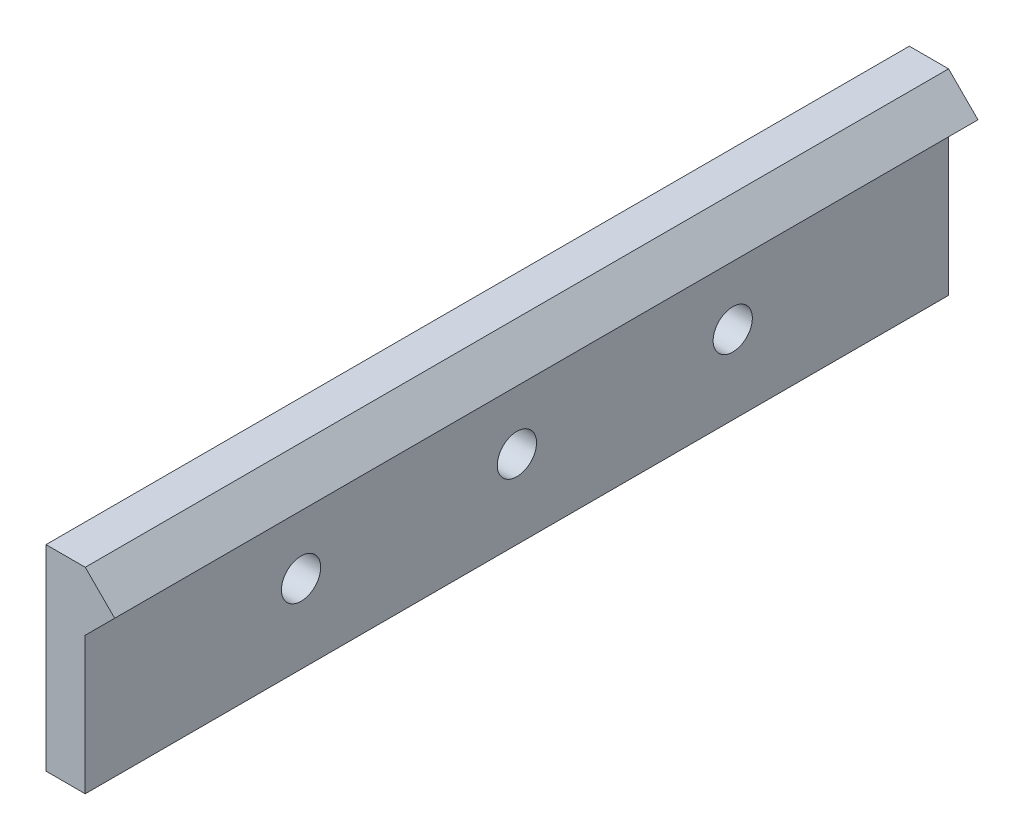
ISO-10303-21;
HEADER;
FILE_DESCRIPTION(('STEP AP214'),'2;1');
FILE_NAME('part.step','',(''),(''),'','','');
FILE_SCHEMA(('AUTOMOTIVE_DESIGN { 1 0 10303 214 1 1 1 1 }'));
ENDSEC;
DATA;
#1=APPLICATION_CONTEXT('core data for automotive mechanical design processes');
#2=APPLICATION_PROTOCOL_DEFINITION('international standard','automotive_design',2000,#1);
#3=PRODUCT_CONTEXT('',#1,'mechanical');
#4=PRODUCT('Part','Part','',(#3));
#5=PRODUCT_RELATED_PRODUCT_CATEGORY('part','',(#4));
#6=PRODUCT_DEFINITION_FORMATION('','',#4);
#7=PRODUCT_DEFINITION_CONTEXT('part definition',#1,'design');
#8=PRODUCT_DEFINITION('design','',#6,#7);
#9=PRODUCT_DEFINITION_SHAPE('','',#8);
#10=(LENGTH_UNIT() NAMED_UNIT(*) SI_UNIT(.MILLI.,.METRE.));
#11=(NAMED_UNIT(*) PLANE_ANGLE_UNIT() SI_UNIT($,.RADIAN.));
#12=(NAMED_UNIT(*) SI_UNIT($,.STERADIAN.) SOLID_ANGLE_UNIT());
#13=UNCERTAINTY_MEASURE_WITH_UNIT(LENGTH_MEASURE(1.E-05),#10,'distance_accuracy_value','');
#14=(GEOMETRIC_REPRESENTATION_CONTEXT(3) GLOBAL_UNCERTAINTY_ASSIGNED_CONTEXT((#13)) GLOBAL_UNIT_ASSIGNED_CONTEXT((#10,
#11,#12)) REPRESENTATION_CONTEXT('',''));
#15=CARTESIAN_POINT('',(0.,0.,0.));
#16=DIRECTION('',(0.,0.,1.));
#17=DIRECTION('',(1.,0.,0.));
#18=AXIS2_PLACEMENT_3D('',#15,#16,#17);
#19=CARTESIAN_POINT('',(-6.34999999999998,0.,139.7));
#20=DIRECTION('',(1.,0.,0.));
#21=DIRECTION('',(0.,1.,0.));
#22=AXIS2_PLACEMENT_3D('',#19,#20,#21);
#23=PLANE('',#22);
#24=CARTESIAN_POINT('',(-6.34999999999997,25.4,69.85));
#25=DIRECTION('',(1.,0.,0.));
#26=DIRECTION('',(0.,1.,0.));
#27=AXIS2_PLACEMENT_3D('',#24,#25,#26);
#28=CIRCLE('',#27,6.35);
#29=CARTESIAN_POINT('',(-6.34999999999998,25.4,63.5));
#30=VERTEX_POINT('',#29);
#31=EDGE_CURVE('E136',#30,#30,#28,.T.);
#32=ORIENTED_EDGE('',*,*,#31,.T.);
#33=EDGE_LOOP('',(#32));
#34=FACE_BOUND('',#33,.T.);
#35=CARTESIAN_POINT('',(-6.34999999999997,25.4,0.));
#36=DIRECTION('',(1.,0.,0.));
#37=DIRECTION('',(0.,1.,0.));
#38=AXIS2_PLACEMENT_3D('',#35,#36,#37);
#39=CIRCLE('',#38,6.35);
#40=CARTESIAN_POINT('',(-6.34999999999998,25.4,-6.35000000000002));
#41=VERTEX_POINT('',#40);
#42=EDGE_CURVE('E154',#41,#41,#39,.T.);
#43=ORIENTED_EDGE('',*,*,#42,.T.);
#44=EDGE_LOOP('',(#43));
#45=FACE_BOUND('',#44,.T.);
#46=CARTESIAN_POINT('',(-6.34999999999997,25.4,-69.85));
#47=DIRECTION('',(1.,0.,0.));
#48=DIRECTION('',(0.,1.,0.));
#49=AXIS2_PLACEMENT_3D('',#46,#47,#48);
#50=CIRCLE('',#49,6.35);
#51=CARTESIAN_POINT('',(-6.34999999999998,25.4,-76.2));
#52=VERTEX_POINT('',#51);
#53=EDGE_CURVE('E151',#52,#52,#50,.T.);
#54=ORIENTED_EDGE('',*,*,#53,.T.);
#55=EDGE_LOOP('',(#54));
#56=FACE_BOUND('',#55,.T.);
#57=DIRECTION('',(0.,-1.,0.));
#58=VECTOR('',#57,1.);
#59=CARTESIAN_POINT('',(-6.34999999999998,0.,-139.7));
#60=LINE('',#59,#58);
#61=CARTESIAN_POINT('',(-6.34999999999997,63.5,-139.7));
#62=VERTEX_POINT('',#61);
#63=CARTESIAN_POINT('',(-6.34999999999998,0.,-139.7));
#64=VERTEX_POINT('',#63);
#65=EDGE_CURVE('E132',#62,#64,#60,.T.);
#66=ORIENTED_EDGE('',*,*,#65,.T.);
#67=DIRECTION('',(0.,0.,-1.));
#68=VECTOR('',#67,1.);
#69=CARTESIAN_POINT('',(-6.34999999999998,0.,139.7));
#70=LINE('',#69,#68);
#71=CARTESIAN_POINT('',(-6.34999999999998,0.,139.7));
#72=VERTEX_POINT('',#71);
#73=EDGE_CURVE('E13',#72,#64,#70,.T.);
#74=ORIENTED_EDGE('',*,*,#73,.F.);
#75=DIRECTION('',(0.,-1.,0.));
#76=VECTOR('',#75,1.);
#77=CARTESIAN_POINT('',(-6.34999999999998,0.,139.7));
#78=LINE('',#77,#76);
#79=CARTESIAN_POINT('',(-6.34999999999997,63.5,139.7));
#80=VERTEX_POINT('',#79);
#81=EDGE_CURVE('E143',#80,#72,#78,.T.);
#82=ORIENTED_EDGE('',*,*,#81,.F.);
#83=DIRECTION('',(0.,0.,-1.));
#84=VECTOR('',#83,1.);
#85=CARTESIAN_POINT('',(-6.34999999999997,63.5,139.7));
#86=LINE('',#85,#84);
#87=EDGE_CURVE('E128',#80,#62,#86,.T.);
#88=ORIENTED_EDGE('',*,*,#87,.T.);
#89=EDGE_LOOP('',(#66,#74,#82,#88));
#90=FACE_BOUND('',#89,.T.);
#91=ADVANCED_FACE('F46',(#34,#45,#56,#90),#23,.F.);
#92=CARTESIAN_POINT('',(-6.34999999999998,0.,139.7));
#93=DIRECTION('',(0.,1.,0.));
#94=DIRECTION('',(0.,0.,1.));
#95=AXIS2_PLACEMENT_3D('',#92,#93,#94);
#96=PLANE('',#95);
#97=DIRECTION('',(1.,0.,0.));
#98=VECTOR('',#97,1.);
#99=CARTESIAN_POINT('',(-6.34999999999998,0.,-139.7));
#100=LINE('',#99,#98);
#101=CARTESIAN_POINT('',(6.35000000000002,0.,-139.7));
#102=VERTEX_POINT('',#101);
#103=EDGE_CURVE('E135',#64,#102,#100,.T.);
#104=ORIENTED_EDGE('',*,*,#103,.T.);
#105=DIRECTION('',(0.,0.,-1.));
#106=VECTOR('',#105,1.);
#107=CARTESIAN_POINT('',(6.35000000000002,0.,139.7));
#108=LINE('',#107,#106);
#109=CARTESIAN_POINT('',(6.35000000000002,0.,139.7));
#110=VERTEX_POINT('',#109);
#111=EDGE_CURVE('E55',#110,#102,#108,.T.);
#112=ORIENTED_EDGE('',*,*,#111,.F.);
#113=DIRECTION('',(1.,0.,0.));
#114=VECTOR('',#113,1.);
#115=CARTESIAN_POINT('',(-6.34999999999998,0.,139.7));
#116=LINE('',#115,#114);
#117=EDGE_CURVE('E101',#72,#110,#116,.T.);
#118=ORIENTED_EDGE('',*,*,#117,.F.);
#119=ORIENTED_EDGE('',*,*,#73,.T.);
#120=EDGE_LOOP('',(#104,#112,#118,#119));
#121=FACE_BOUND('',#120,.T.);
#122=ADVANCED_FACE('F169',(#121),#96,.F.);
#123=CARTESIAN_POINT('',(6.35000000000002,44.45,139.7));
#124=DIRECTION('',(-1.,0.,0.));
#125=DIRECTION('',(0.,-1.,0.));
#126=AXIS2_PLACEMENT_3D('',#123,#124,#125);
#127=PLANE('',#126);
#128=CARTESIAN_POINT('',(6.35000000000002,25.4,69.85));
#129=DIRECTION('',(-1.,0.,0.));
#130=DIRECTION('',(0.,-1.,0.));
#131=AXIS2_PLACEMENT_3D('',#128,#129,#130);
#132=CIRCLE('',#131,6.35);
#133=CARTESIAN_POINT('',(6.35000000000002,25.4,63.5));
#134=VERTEX_POINT('',#133);
#135=EDGE_CURVE('E49',#134,#134,#132,.T.);
#136=ORIENTED_EDGE('',*,*,#135,.T.);
#137=EDGE_LOOP('',(#136));
#138=FACE_BOUND('',#137,.T.);
#139=CARTESIAN_POINT('',(6.35000000000002,25.4,0.));
#140=DIRECTION('',(-1.,0.,0.));
#141=DIRECTION('',(0.,-1.,0.));
#142=AXIS2_PLACEMENT_3D('',#139,#140,#141);
#143=CIRCLE('',#142,6.35);
#144=CARTESIAN_POINT('',(6.35000000000002,25.4,-6.35000000000002));
#145=VERTEX_POINT('',#144);
#146=EDGE_CURVE('E152',#145,#145,#143,.T.);
#147=ORIENTED_EDGE('',*,*,#146,.T.);
#148=EDGE_LOOP('',(#147));
#149=FACE_BOUND('',#148,.T.);
#150=CARTESIAN_POINT('',(6.35000000000002,25.4,-69.85));
#151=DIRECTION('',(-1.,0.,0.));
#152=DIRECTION('',(0.,-1.,0.));
#153=AXIS2_PLACEMENT_3D('',#150,#151,#152);
#154=CIRCLE('',#153,6.35);
#155=CARTESIAN_POINT('',(6.35000000000002,25.4,-76.2));
#156=VERTEX_POINT('',#155);
#157=EDGE_CURVE('E149',#156,#156,#154,.T.);
#158=ORIENTED_EDGE('',*,*,#157,.T.);
#159=EDGE_LOOP('',(#158));
#160=FACE_BOUND('',#159,.T.);
#161=DIRECTION('',(0.,1.,0.));
#162=VECTOR('',#161,1.);
#163=CARTESIAN_POINT('',(6.35000000000002,44.45,-139.7));
#164=LINE('',#163,#162);
#165=CARTESIAN_POINT('',(6.35000000000002,44.45,-139.7));
#166=VERTEX_POINT('',#165);
#167=EDGE_CURVE('E138',#102,#166,#164,.T.);
#168=ORIENTED_EDGE('',*,*,#167,.T.);
#169=DIRECTION('',(0.,0.,-1.));
#170=VECTOR('',#169,1.);
#171=CARTESIAN_POINT('',(6.35000000000002,44.45,139.7));
#172=LINE('',#171,#170);
#173=CARTESIAN_POINT('',(6.35000000000002,44.45,139.7));
#174=VERTEX_POINT('',#173);
#175=EDGE_CURVE('E123',#174,#166,#172,.T.);
#176=ORIENTED_EDGE('',*,*,#175,.F.);
#177=DIRECTION('',(0.,1.,0.));
#178=VECTOR('',#177,1.);
#179=CARTESIAN_POINT('',(6.35000000000002,44.45,139.7));
#180=LINE('',#179,#178);
#181=EDGE_CURVE('E114',#110,#174,#180,.T.);
#182=ORIENTED_EDGE('',*,*,#181,.F.);
#183=ORIENTED_EDGE('',*,*,#111,.T.);
#184=EDGE_LOOP('',(#168,#176,#182,#183));
#185=FACE_BOUND('',#184,.T.);
#186=ADVANCED_FACE('F172',(#138,#149,#160,#185),#127,.F.);
#187=CARTESIAN_POINT('',(6.35000000000002,44.45,139.7));
#188=DIRECTION('',(-0.707106781186552,0.707106781186543,0.));
#189=DIRECTION('',(-0.707106781186543,-0.707106781186552,0.));
#190=AXIS2_PLACEMENT_3D('',#187,#188,#189);
#191=PLANE('',#190);
#192=DIRECTION('',(0.707106781186543,0.707106781186552,0.));
#193=VECTOR('',#192,1.);
#194=CARTESIAN_POINT('',(6.35000000000002,44.45,-139.7));
#195=LINE('',#194,#193);
#196=CARTESIAN_POINT('',(15.875,53.975,-139.7));
#197=VERTEX_POINT('',#196);
#198=EDGE_CURVE('E122',#166,#197,#195,.T.);
#199=ORIENTED_EDGE('',*,*,#198,.T.);
#200=DIRECTION('',(0.,0.,-1.));
#201=VECTOR('',#200,1.);
#202=CARTESIAN_POINT('',(15.875,53.975,139.7));
#203=LINE('',#202,#201);
#204=CARTESIAN_POINT('',(15.875,53.975,139.7));
#205=VERTEX_POINT('',#204);
#206=EDGE_CURVE('E119',#205,#197,#203,.T.);
#207=ORIENTED_EDGE('',*,*,#206,.F.);
#208=DIRECTION('',(0.707106781186543,0.707106781186552,0.));
#209=VECTOR('',#208,1.);
#210=CARTESIAN_POINT('',(6.35000000000002,44.45,139.7));
#211=LINE('',#210,#209);
#212=EDGE_CURVE('E108',#174,#205,#211,.T.);
#213=ORIENTED_EDGE('',*,*,#212,.F.);
#214=ORIENTED_EDGE('',*,*,#175,.T.);
#215=EDGE_LOOP('',(#199,#207,#213,#214));
#216=FACE_BOUND('',#215,.T.);
#217=ADVANCED_FACE('F120',(#216),#191,.F.);
#218=CARTESIAN_POINT('',(6.35000000000002,63.5,139.7));
#219=DIRECTION('',(-0.707106781186549,-0.707106781186546,0.));
#220=DIRECTION('',(0.707106781186546,-0.707106781186549,0.));
#221=AXIS2_PLACEMENT_3D('',#218,#219,#220);
#222=PLANE('',#221);
#223=DIRECTION('',(-0.707106781186546,0.707106781186549,0.));
#224=VECTOR('',#223,1.);
#225=CARTESIAN_POINT('',(6.35000000000002,63.5,-139.7));
#226=LINE('',#225,#224);
#227=CARTESIAN_POINT('',(6.35000000000002,63.5,-139.7));
#228=VERTEX_POINT('',#227);
#229=EDGE_CURVE('E87',#197,#228,#226,.T.);
#230=ORIENTED_EDGE('',*,*,#229,.T.);
#231=DIRECTION('',(0.,0.,-1.));
#232=VECTOR('',#231,1.);
#233=CARTESIAN_POINT('',(6.35000000000002,63.5,139.7));
#234=LINE('',#233,#232);
#235=CARTESIAN_POINT('',(6.35000000000002,63.5,139.7));
#236=VERTEX_POINT('',#235);
#237=EDGE_CURVE('E124',#236,#228,#234,.T.);
#238=ORIENTED_EDGE('',*,*,#237,.F.);
#239=DIRECTION('',(-0.707106781186546,0.707106781186549,0.));
#240=VECTOR('',#239,1.);
#241=CARTESIAN_POINT('',(6.35000000000002,63.5,139.7));
#242=LINE('',#241,#240);
#243=EDGE_CURVE('E112',#205,#236,#242,.T.);
#244=ORIENTED_EDGE('',*,*,#243,.F.);
#245=ORIENTED_EDGE('',*,*,#206,.T.);
#246=EDGE_LOOP('',(#230,#238,#244,#245));
#247=FACE_BOUND('',#246,.T.);
#248=ADVANCED_FACE('F126',(#247),#222,.F.);
#249=CARTESIAN_POINT('',(-6.34999999999997,63.5,139.7));
#250=DIRECTION('',(0.,-1.,0.));
#251=DIRECTION('',(0.,0.,-1.));
#252=AXIS2_PLACEMENT_3D('',#249,#250,#251);
#253=PLANE('',#252);
#254=DIRECTION('',(-1.,0.,0.));
#255=VECTOR('',#254,1.);
#256=CARTESIAN_POINT('',(-6.34999999999997,63.5,-139.7));
#257=LINE('',#256,#255);
#258=EDGE_CURVE('E93',#228,#62,#257,.T.);
#259=ORIENTED_EDGE('',*,*,#258,.T.);
#260=ORIENTED_EDGE('',*,*,#87,.F.);
#261=DIRECTION('',(-1.,0.,0.));
#262=VECTOR('',#261,1.);
#263=CARTESIAN_POINT('',(-6.34999999999997,63.5,139.7));
#264=LINE('',#263,#262);
#265=EDGE_CURVE('E64',#236,#80,#264,.T.);
#266=ORIENTED_EDGE('',*,*,#265,.F.);
#267=ORIENTED_EDGE('',*,*,#237,.T.);
#268=EDGE_LOOP('',(#259,#260,#266,#267));
#269=FACE_BOUND('',#268,.T.);
#270=ADVANCED_FACE('F177',(#269),#253,.F.);
#271=CARTESIAN_POINT('',(0.,0.,139.7));
#272=DIRECTION('',(0.,0.,-1.));
#273=DIRECTION('',(-1.,0.,0.));
#274=AXIS2_PLACEMENT_3D('',#271,#272,#273);
#275=PLANE('',#274);
#276=ORIENTED_EDGE('',*,*,#81,.T.);
#277=ORIENTED_EDGE('',*,*,#117,.T.);
#278=ORIENTED_EDGE('',*,*,#181,.T.);
#279=ORIENTED_EDGE('',*,*,#212,.T.);
#280=ORIENTED_EDGE('',*,*,#243,.T.);
#281=ORIENTED_EDGE('',*,*,#265,.T.);
#282=EDGE_LOOP('',(#276,#277,#278,#279,#280,#281));
#283=FACE_BOUND('',#282,.T.);
#284=ADVANCED_FACE('F110',(#283),#275,.F.);
#285=CARTESIAN_POINT('',(0.,0.,-139.7));
#286=DIRECTION('',(0.,0.,-1.));
#287=DIRECTION('',(-1.,0.,0.));
#288=AXIS2_PLACEMENT_3D('',#285,#286,#287);
#289=PLANE('',#288);
#290=ORIENTED_EDGE('',*,*,#65,.F.);
#291=ORIENTED_EDGE('',*,*,#258,.F.);
#292=ORIENTED_EDGE('',*,*,#229,.F.);
#293=ORIENTED_EDGE('',*,*,#198,.F.);
#294=ORIENTED_EDGE('',*,*,#167,.F.);
#295=ORIENTED_EDGE('',*,*,#103,.F.);
#296=EDGE_LOOP('',(#290,#291,#292,#293,#294,#295));
#297=FACE_BOUND('',#296,.T.);
#298=ADVANCED_FACE('F175',(#297),#289,.T.);
#299=CARTESIAN_POINT('',(-38.1,25.4,-69.85));
#300=DIRECTION('',(1.,0.,0.));
#301=DIRECTION('',(0.,0.,-1.));
#302=AXIS2_PLACEMENT_3D('',#299,#300,#301);
#303=CYLINDRICAL_SURFACE('',#302,6.35);
#304=CARTESIAN_POINT('',(6.35000000000002,25.4,-76.2));
#305=CARTESIAN_POINT('',(6.21770833333336,25.4,-76.2));
#306=CARTESIAN_POINT('',(6.08541666666669,25.4,-76.2));
#307=CARTESIAN_POINT('',(5.82083333333336,25.4,-76.2));
#308=CARTESIAN_POINT('',(5.68854166666669,25.4,-76.2));
#309=CARTESIAN_POINT('',(5.42395833333335,25.4,-76.2));
#310=CARTESIAN_POINT('',(5.29166666666669,25.4,-76.2));
#311=CARTESIAN_POINT('',(5.02708333333336,25.4,-76.2));
#312=CARTESIAN_POINT('',(4.89479166666669,25.4,-76.2));
#313=CARTESIAN_POINT('',(4.63020833333336,25.4,-76.2));
#314=CARTESIAN_POINT('',(4.49791666666669,25.4,-76.2));
#315=CARTESIAN_POINT('',(4.23333333333335,25.4,-76.2));
#316=CARTESIAN_POINT('',(4.10104166666669,25.4,-76.2));
#317=CARTESIAN_POINT('',(3.83645833333336,25.4,-76.2));
#318=CARTESIAN_POINT('',(3.70416666666669,25.4,-76.2));
#319=CARTESIAN_POINT('',(3.43958333333336,25.4,-76.2));
#320=CARTESIAN_POINT('',(3.30729166666669,25.4,-76.2));
#321=CARTESIAN_POINT('',(3.04270833333336,25.4,-76.2));
#322=CARTESIAN_POINT('',(2.91041666666669,25.4,-76.2));
#323=CARTESIAN_POINT('',(2.64583333333335,25.4,-76.2));
#324=CARTESIAN_POINT('',(2.51354166666669,25.4,-76.2));
#325=CARTESIAN_POINT('',(2.24895833333336,25.4,-76.2));
#326=CARTESIAN_POINT('',(2.11666666666669,25.4,-76.2));
#327=CARTESIAN_POINT('',(1.85208333333336,25.4,-76.2));
#328=CARTESIAN_POINT('',(1.71979166666669,25.4,-76.2));
#329=CARTESIAN_POINT('',(1.45520833333335,25.4,-76.2));
#330=CARTESIAN_POINT('',(1.32291666666669,25.4,-76.2));
#331=CARTESIAN_POINT('',(1.05833333333336,25.4,-76.2));
#332=CARTESIAN_POINT('',(0.92604166666669,25.4,-76.2));
#333=CARTESIAN_POINT('',(0.661458333333355,25.4,-76.2));
#334=CARTESIAN_POINT('',(0.529166666666687,25.4,-76.2));
#335=CARTESIAN_POINT('',(0.264583333333353,25.4,-76.2));
#336=CARTESIAN_POINT('',(0.132291666666687,25.4,-76.2));
#337=CARTESIAN_POINT('',(-0.132291666666645,25.4,-76.2));
#338=CARTESIAN_POINT('',(-0.264583333333311,25.4,-76.2));
#339=CARTESIAN_POINT('',(-0.529166666666645,25.4,-76.2));
#340=CARTESIAN_POINT('',(-0.661458333333314,25.4,-76.2));
#341=CARTESIAN_POINT('',(-0.926041666666648,25.4,-76.2));
#342=CARTESIAN_POINT('',(-1.05833333333331,25.4,-76.2));
#343=CARTESIAN_POINT('',(-1.32291666666665,25.4,-76.2));
#344=CARTESIAN_POINT('',(-1.45520833333331,25.4,-76.2));
#345=CARTESIAN_POINT('',(-1.71979166666665,25.4,-76.2));
#346=CARTESIAN_POINT('',(-1.85208333333331,25.4,-76.2));
#347=CARTESIAN_POINT('',(-2.11666666666665,25.4,-76.2));
#348=CARTESIAN_POINT('',(-2.24895833333331,25.4,-76.2));
#349=CARTESIAN_POINT('',(-2.51354166666665,25.4,-76.2));
#350=CARTESIAN_POINT('',(-2.64583333333331,25.4,-76.2));
#351=CARTESIAN_POINT('',(-2.91041666666665,25.4,-76.2));
#352=CARTESIAN_POINT('',(-3.04270833333332,25.4,-76.2));
#353=CARTESIAN_POINT('',(-3.30729166666665,25.4,-76.2));
#354=CARTESIAN_POINT('',(-3.43958333333332,25.4,-76.2));
#355=CARTESIAN_POINT('',(-3.70416666666665,25.4,-76.2));
#356=CARTESIAN_POINT('',(-3.83645833333331,25.4,-76.2));
#357=CARTESIAN_POINT('',(-4.10104166666665,25.4,-76.2));
#358=CARTESIAN_POINT('',(-4.23333333333332,25.4,-76.2));
#359=CARTESIAN_POINT('',(-4.49791666666665,25.4,-76.2));
#360=CARTESIAN_POINT('',(-4.63020833333332,25.4,-76.2));
#361=CARTESIAN_POINT('',(-4.89479166666665,25.4,-76.2));
#362=CARTESIAN_POINT('',(-5.02708333333331,25.4,-76.2));
#363=CARTESIAN_POINT('',(-5.29166666666665,25.4,-76.2));
#364=CARTESIAN_POINT('',(-5.42395833333332,25.4,-76.2));
#365=CARTESIAN_POINT('',(-5.68854166666665,25.4,-76.2));
#366=CARTESIAN_POINT('',(-5.82083333333332,25.4,-76.2));
#367=CARTESIAN_POINT('',(-6.08541666666665,25.4,-76.2));
#368=CARTESIAN_POINT('',(-6.21770833333331,25.4,-76.2));
#369=CARTESIAN_POINT('',(-6.34999999999998,25.4,-76.2));
#370=B_SPLINE_CURVE_WITH_KNOTS('',3,(#304,#305,#306,#307,#308,#309,#310,#311,#312,#313,#314,
#315,#316,#317,#318,#319,#320,#321,#322,#323,#324,#325,#326,#327,#328,#329,#330,#331,#332,#333,
#334,#335,#336,#337,#338,#339,#340,#341,#342,#343,#344,#345,#346,#347,#348,#349,#350,#351,#352,
#353,#354,#355,#356,#357,#358,#359,#360,#361,#362,#363,#364,#365,#366,#367,#368,#369),
.UNSPECIFIED.,.F.,.F.,(4,2,2,2,2,2,2,2,2,2,2,2,2,2,2,2,2,2,2,2,2,2,2,2,2,2,2,2,2,2,2,2,4),(0.,
0.396874999999998,0.793750000000003,1.190625,1.5875,1.984375,2.38125,2.778125,3.175,3.571875,
3.96875,4.365625,4.7625,5.159375,5.55625,5.953125,6.35,6.746875,7.14375,7.540625,7.9375,
8.334375,8.73125,9.128125,9.52500000000001,9.921875,10.31875,10.715625,11.1125,11.509375,
11.90625,12.303125,12.7),.UNSPECIFIED.);
#371=EDGE_CURVE('BSEAM199',#156,#52,#370,.T.);
#372=ORIENTED_EDGE('',*,*,#157,.F.);
#373=ORIENTED_EDGE('',*,*,#53,.F.);
#374=ORIENTED_EDGE('',*,*,#371,.T.);
#375=ORIENTED_EDGE('',*,*,#371,.F.);
#376=EDGE_LOOP('',(#372,#374,#373,#375));
#377=FACE_BOUND('',#376,.T.);
#378=ADVANCED_FACE('F199',(#377),#303,.F.);
#379=CARTESIAN_POINT('',(-38.1,25.4,0.));
#380=DIRECTION('',(1.,0.,0.));
#381=DIRECTION('',(0.,0.,-1.));
#382=AXIS2_PLACEMENT_3D('',#379,#380,#381);
#383=CYLINDRICAL_SURFACE('',#382,6.35);
#384=CARTESIAN_POINT('',(6.35000000000002,25.4,-6.35000000000002));
#385=CARTESIAN_POINT('',(6.21770833333336,25.4,-6.35000000000002));
#386=CARTESIAN_POINT('',(6.08541666666669,25.4,-6.35000000000002));
#387=CARTESIAN_POINT('',(5.82083333333336,25.4,-6.35000000000002));
#388=CARTESIAN_POINT('',(5.68854166666669,25.4,-6.35000000000002));
#389=CARTESIAN_POINT('',(5.42395833333335,25.4,-6.35000000000002));
#390=CARTESIAN_POINT('',(5.29166666666669,25.4,-6.35000000000002));
#391=CARTESIAN_POINT('',(5.02708333333336,25.4,-6.35000000000002));
#392=CARTESIAN_POINT('',(4.89479166666669,25.4,-6.35000000000002));
#393=CARTESIAN_POINT('',(4.63020833333336,25.4,-6.35000000000002));
#394=CARTESIAN_POINT('',(4.49791666666669,25.4,-6.35000000000002));
#395=CARTESIAN_POINT('',(4.23333333333335,25.4,-6.35000000000002));
#396=CARTESIAN_POINT('',(4.10104166666669,25.4,-6.35000000000002));
#397=CARTESIAN_POINT('',(3.83645833333336,25.4,-6.35000000000002));
#398=CARTESIAN_POINT('',(3.70416666666669,25.4,-6.35000000000002));
#399=CARTESIAN_POINT('',(3.43958333333336,25.4,-6.35000000000002));
#400=CARTESIAN_POINT('',(3.30729166666669,25.4,-6.35000000000002));
#401=CARTESIAN_POINT('',(3.04270833333336,25.4,-6.35000000000002));
#402=CARTESIAN_POINT('',(2.91041666666669,25.4,-6.35000000000002));
#403=CARTESIAN_POINT('',(2.64583333333335,25.4,-6.35000000000002));
#404=CARTESIAN_POINT('',(2.51354166666669,25.4,-6.35000000000002));
#405=CARTESIAN_POINT('',(2.24895833333336,25.4,-6.35000000000002));
#406=CARTESIAN_POINT('',(2.11666666666669,25.4,-6.35000000000002));
#407=CARTESIAN_POINT('',(1.85208333333336,25.4,-6.35000000000002));
#408=CARTESIAN_POINT('',(1.71979166666669,25.4,-6.35000000000002));
#409=CARTESIAN_POINT('',(1.45520833333335,25.4,-6.35000000000002));
#410=CARTESIAN_POINT('',(1.32291666666669,25.4,-6.35000000000002));
#411=CARTESIAN_POINT('',(1.05833333333336,25.4,-6.35000000000002));
#412=CARTESIAN_POINT('',(0.92604166666669,25.4,-6.35000000000002));
#413=CARTESIAN_POINT('',(0.661458333333355,25.4,-6.35000000000002));
#414=CARTESIAN_POINT('',(0.529166666666687,25.4,-6.35000000000002));
#415=CARTESIAN_POINT('',(0.264583333333353,25.4,-6.35000000000002));
#416=CARTESIAN_POINT('',(0.132291666666687,25.4,-6.35000000000002));
#417=CARTESIAN_POINT('',(-0.132291666666645,25.4,-6.35000000000002));
#418=CARTESIAN_POINT('',(-0.264583333333311,25.4,-6.35000000000002));
#419=CARTESIAN_POINT('',(-0.529166666666645,25.4,-6.35000000000002));
#420=CARTESIAN_POINT('',(-0.661458333333314,25.4,-6.35000000000002));
#421=CARTESIAN_POINT('',(-0.926041666666648,25.4,-6.35000000000002));
#422=CARTESIAN_POINT('',(-1.05833333333331,25.4,-6.35000000000002));
#423=CARTESIAN_POINT('',(-1.32291666666665,25.4,-6.35000000000002));
#424=CARTESIAN_POINT('',(-1.45520833333331,25.4,-6.35000000000002));
#425=CARTESIAN_POINT('',(-1.71979166666665,25.4,-6.35000000000002));
#426=CARTESIAN_POINT('',(-1.85208333333331,25.4,-6.35000000000002));
#427=CARTESIAN_POINT('',(-2.11666666666665,25.4,-6.35000000000002));
#428=CARTESIAN_POINT('',(-2.24895833333331,25.4,-6.35000000000002));
#429=CARTESIAN_POINT('',(-2.51354166666665,25.4,-6.35000000000002));
#430=CARTESIAN_POINT('',(-2.64583333333331,25.4,-6.35000000000002));
#431=CARTESIAN_POINT('',(-2.91041666666665,25.4,-6.35000000000002));
#432=CARTESIAN_POINT('',(-3.04270833333332,25.4,-6.35000000000002));
#433=CARTESIAN_POINT('',(-3.30729166666665,25.4,-6.35000000000002));
#434=CARTESIAN_POINT('',(-3.43958333333332,25.4,-6.35000000000002));
#435=CARTESIAN_POINT('',(-3.70416666666665,25.4,-6.35000000000002));
#436=CARTESIAN_POINT('',(-3.83645833333331,25.4,-6.35000000000002));
#437=CARTESIAN_POINT('',(-4.10104166666665,25.4,-6.35000000000002));
#438=CARTESIAN_POINT('',(-4.23333333333332,25.4,-6.35000000000002));
#439=CARTESIAN_POINT('',(-4.49791666666665,25.4,-6.35000000000002));
#440=CARTESIAN_POINT('',(-4.63020833333332,25.4,-6.35000000000002));
#441=CARTESIAN_POINT('',(-4.89479166666665,25.4,-6.35000000000002));
#442=CARTESIAN_POINT('',(-5.02708333333331,25.4,-6.35000000000002));
#443=CARTESIAN_POINT('',(-5.29166666666665,25.4,-6.35000000000002));
#444=CARTESIAN_POINT('',(-5.42395833333332,25.4,-6.35000000000002));
#445=CARTESIAN_POINT('',(-5.68854166666665,25.4,-6.35000000000002));
#446=CARTESIAN_POINT('',(-5.82083333333332,25.4,-6.35000000000002));
#447=CARTESIAN_POINT('',(-6.08541666666665,25.4,-6.35000000000002));
#448=CARTESIAN_POINT('',(-6.21770833333331,25.4,-6.35000000000002));
#449=CARTESIAN_POINT('',(-6.34999999999998,25.4,-6.35000000000002));
#450=B_SPLINE_CURVE_WITH_KNOTS('',3,(#384,#385,#386,#387,#388,#389,#390,#391,#392,#393,#394,
#395,#396,#397,#398,#399,#400,#401,#402,#403,#404,#405,#406,#407,#408,#409,#410,#411,#412,#413,
#414,#415,#416,#417,#418,#419,#420,#421,#422,#423,#424,#425,#426,#427,#428,#429,#430,#431,#432,
#433,#434,#435,#436,#437,#438,#439,#440,#441,#442,#443,#444,#445,#446,#447,#448,#449),
.UNSPECIFIED.,.F.,.F.,(4,2,2,2,2,2,2,2,2,2,2,2,2,2,2,2,2,2,2,2,2,2,2,2,2,2,2,2,2,2,2,2,4),(0.,
0.396874999999998,0.793750000000003,1.190625,1.5875,1.984375,2.38125,2.778125,3.175,3.571875,
3.96875,4.365625,4.7625,5.159375,5.55625,5.953125,6.35,6.746875,7.14375,7.540625,7.9375,
8.334375,8.73125,9.128125,9.52500000000001,9.921875,10.31875,10.715625,11.1125,11.509375,
11.90625,12.303125,12.7),.UNSPECIFIED.);
#451=EDGE_CURVE('BSEAM196',#145,#41,#450,.T.);
#452=ORIENTED_EDGE('',*,*,#146,.F.);
#453=ORIENTED_EDGE('',*,*,#42,.F.);
#454=ORIENTED_EDGE('',*,*,#451,.T.);
#455=ORIENTED_EDGE('',*,*,#451,.F.);
#456=EDGE_LOOP('',(#452,#454,#453,#455));
#457=FACE_BOUND('',#456,.T.);
#458=ADVANCED_FACE('F196',(#457),#383,.F.);
#459=CARTESIAN_POINT('',(-38.1,25.4,69.85));
#460=DIRECTION('',(1.,0.,0.));
#461=DIRECTION('',(0.,0.,-1.));
#462=AXIS2_PLACEMENT_3D('',#459,#460,#461);
#463=CYLINDRICAL_SURFACE('',#462,6.35);
#464=CARTESIAN_POINT('',(6.35000000000002,25.4,63.5));
#465=CARTESIAN_POINT('',(6.21770833333336,25.4,63.5));
#466=CARTESIAN_POINT('',(6.08541666666669,25.4,63.5));
#467=CARTESIAN_POINT('',(5.82083333333336,25.4,63.5));
#468=CARTESIAN_POINT('',(5.68854166666669,25.4,63.5));
#469=CARTESIAN_POINT('',(5.42395833333335,25.4,63.5));
#470=CARTESIAN_POINT('',(5.29166666666669,25.4,63.5));
#471=CARTESIAN_POINT('',(5.02708333333336,25.4,63.5));
#472=CARTESIAN_POINT('',(4.89479166666669,25.4,63.5));
#473=CARTESIAN_POINT('',(4.63020833333336,25.4,63.5));
#474=CARTESIAN_POINT('',(4.49791666666669,25.4,63.5));
#475=CARTESIAN_POINT('',(4.23333333333335,25.4,63.5));
#476=CARTESIAN_POINT('',(4.10104166666669,25.4,63.5));
#477=CARTESIAN_POINT('',(3.83645833333336,25.4,63.5));
#478=CARTESIAN_POINT('',(3.70416666666669,25.4,63.5));
#479=CARTESIAN_POINT('',(3.43958333333336,25.4,63.5));
#480=CARTESIAN_POINT('',(3.30729166666669,25.4,63.5));
#481=CARTESIAN_POINT('',(3.04270833333336,25.4,63.5));
#482=CARTESIAN_POINT('',(2.91041666666669,25.4,63.5));
#483=CARTESIAN_POINT('',(2.64583333333335,25.4,63.5));
#484=CARTESIAN_POINT('',(2.51354166666669,25.4,63.5));
#485=CARTESIAN_POINT('',(2.24895833333336,25.4,63.5));
#486=CARTESIAN_POINT('',(2.11666666666669,25.4,63.5));
#487=CARTESIAN_POINT('',(1.85208333333336,25.4,63.5));
#488=CARTESIAN_POINT('',(1.71979166666669,25.4,63.5));
#489=CARTESIAN_POINT('',(1.45520833333335,25.4,63.5));
#490=CARTESIAN_POINT('',(1.32291666666669,25.4,63.5));
#491=CARTESIAN_POINT('',(1.05833333333336,25.4,63.5));
#492=CARTESIAN_POINT('',(0.92604166666669,25.4,63.5));
#493=CARTESIAN_POINT('',(0.661458333333355,25.4,63.5));
#494=CARTESIAN_POINT('',(0.529166666666687,25.4,63.5));
#495=CARTESIAN_POINT('',(0.264583333333353,25.4,63.5));
#496=CARTESIAN_POINT('',(0.132291666666687,25.4,63.5));
#497=CARTESIAN_POINT('',(-0.132291666666645,25.4,63.5));
#498=CARTESIAN_POINT('',(-0.264583333333311,25.4,63.5));
#499=CARTESIAN_POINT('',(-0.529166666666645,25.4,63.5));
#500=CARTESIAN_POINT('',(-0.661458333333314,25.4,63.5));
#501=CARTESIAN_POINT('',(-0.926041666666648,25.4,63.5));
#502=CARTESIAN_POINT('',(-1.05833333333331,25.4,63.5));
#503=CARTESIAN_POINT('',(-1.32291666666665,25.4,63.5));
#504=CARTESIAN_POINT('',(-1.45520833333331,25.4,63.5));
#505=CARTESIAN_POINT('',(-1.71979166666665,25.4,63.5));
#506=CARTESIAN_POINT('',(-1.85208333333331,25.4,63.5));
#507=CARTESIAN_POINT('',(-2.11666666666665,25.4,63.5));
#508=CARTESIAN_POINT('',(-2.24895833333331,25.4,63.5));
#509=CARTESIAN_POINT('',(-2.51354166666665,25.4,63.5));
#510=CARTESIAN_POINT('',(-2.64583333333331,25.4,63.5));
#511=CARTESIAN_POINT('',(-2.91041666666665,25.4,63.5));
#512=CARTESIAN_POINT('',(-3.04270833333332,25.4,63.5));
#513=CARTESIAN_POINT('',(-3.30729166666665,25.4,63.5));
#514=CARTESIAN_POINT('',(-3.43958333333332,25.4,63.5));
#515=CARTESIAN_POINT('',(-3.70416666666665,25.4,63.5));
#516=CARTESIAN_POINT('',(-3.83645833333331,25.4,63.5));
#517=CARTESIAN_POINT('',(-4.10104166666665,25.4,63.5));
#518=CARTESIAN_POINT('',(-4.23333333333332,25.4,63.5));
#519=CARTESIAN_POINT('',(-4.49791666666665,25.4,63.5));
#520=CARTESIAN_POINT('',(-4.63020833333332,25.4,63.5));
#521=CARTESIAN_POINT('',(-4.89479166666665,25.4,63.5));
#522=CARTESIAN_POINT('',(-5.02708333333331,25.4,63.5));
#523=CARTESIAN_POINT('',(-5.29166666666665,25.4,63.5));
#524=CARTESIAN_POINT('',(-5.42395833333332,25.4,63.5));
#525=CARTESIAN_POINT('',(-5.68854166666665,25.4,63.5));
#526=CARTESIAN_POINT('',(-5.82083333333332,25.4,63.5));
#527=CARTESIAN_POINT('',(-6.08541666666665,25.4,63.5));
#528=CARTESIAN_POINT('',(-6.21770833333331,25.4,63.5));
#529=CARTESIAN_POINT('',(-6.34999999999998,25.4,63.5));
#530=B_SPLINE_CURVE_WITH_KNOTS('',3,(#464,#465,#466,#467,#468,#469,#470,#471,#472,#473,#474,
#475,#476,#477,#478,#479,#480,#481,#482,#483,#484,#485,#486,#487,#488,#489,#490,#491,#492,#493,
#494,#495,#496,#497,#498,#499,#500,#501,#502,#503,#504,#505,#506,#507,#508,#509,#510,#511,#512,
#513,#514,#515,#516,#517,#518,#519,#520,#521,#522,#523,#524,#525,#526,#527,#528,#529),
.UNSPECIFIED.,.F.,.F.,(4,2,2,2,2,2,2,2,2,2,2,2,2,2,2,2,2,2,2,2,2,2,2,2,2,2,2,2,2,2,2,2,4),(0.,
0.396874999999998,0.793750000000003,1.190625,1.5875,1.984375,2.38125,2.778125,3.175,3.571875,
3.96875,4.365625,4.7625,5.159375,5.55625,5.953125,6.35,6.746875,7.14375,7.540625,7.9375,
8.334375,8.73125,9.128125,9.52500000000001,9.921875,10.31875,10.715625,11.1125,11.509375,
11.90625,12.303125,12.7),.UNSPECIFIED.);
#531=EDGE_CURVE('BSEAM198',#134,#30,#530,.T.);
#532=ORIENTED_EDGE('',*,*,#135,.F.);
#533=ORIENTED_EDGE('',*,*,#31,.F.);
#534=ORIENTED_EDGE('',*,*,#531,.T.);
#535=ORIENTED_EDGE('',*,*,#531,.F.);
#536=EDGE_LOOP('',(#532,#534,#533,#535));
#537=FACE_BOUND('',#536,.T.);
#538=ADVANCED_FACE('F198',(#537),#463,.F.);
#539=CLOSED_SHELL('',(#91,#122,#186,#217,#248,#270,#284,#298,#378,#458,#538));
#540=MANIFOLD_SOLID_BREP('B2',#539);
#541=ADVANCED_BREP_SHAPE_REPRESENTATION('',(#18,#540),#14);
#542=SHAPE_DEFINITION_REPRESENTATION(#9,#541);
ENDSEC;
END-ISO-10303-21;
